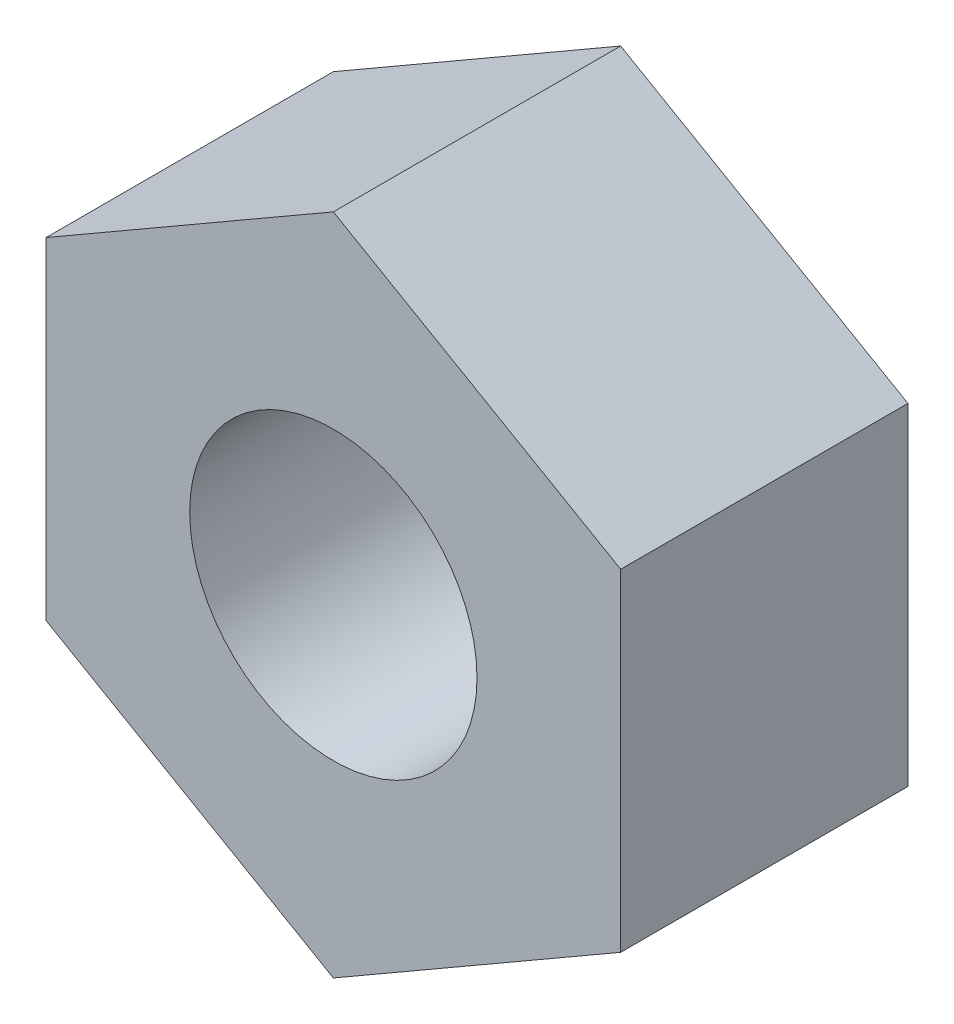
ISO-10303-21;
HEADER;
FILE_DESCRIPTION(('STEP AP214'),'2;1');
FILE_NAME('part.step','',(''),(''),'','','');
FILE_SCHEMA(('AUTOMOTIVE_DESIGN { 1 0 10303 214 1 1 1 1 }'));
ENDSEC;
DATA;
#1=APPLICATION_CONTEXT('core data for automotive mechanical design processes');
#2=APPLICATION_PROTOCOL_DEFINITION('international standard','automotive_design',2000,#1);
#3=PRODUCT_CONTEXT('',#1,'mechanical');
#4=PRODUCT('Part','Part','',(#3));
#5=PRODUCT_RELATED_PRODUCT_CATEGORY('part','',(#4));
#6=PRODUCT_DEFINITION_FORMATION('','',#4);
#7=PRODUCT_DEFINITION_CONTEXT('part definition',#1,'design');
#8=PRODUCT_DEFINITION('design','',#6,#7);
#9=PRODUCT_DEFINITION_SHAPE('','',#8);
#10=(LENGTH_UNIT() NAMED_UNIT(*) SI_UNIT(.MILLI.,.METRE.));
#11=(NAMED_UNIT(*) PLANE_ANGLE_UNIT() SI_UNIT($,.RADIAN.));
#12=(NAMED_UNIT(*) SI_UNIT($,.STERADIAN.) SOLID_ANGLE_UNIT());
#13=UNCERTAINTY_MEASURE_WITH_UNIT(LENGTH_MEASURE(1.E-05),#10,'distance_accuracy_value','');
#14=(GEOMETRIC_REPRESENTATION_CONTEXT(3) GLOBAL_UNCERTAINTY_ASSIGNED_CONTEXT((#13)) GLOBAL_UNIT_ASSIGNED_CONTEXT((#10,
#11,#12)) REPRESENTATION_CONTEXT('',''));
#15=CARTESIAN_POINT('',(0.,0.,0.));
#16=DIRECTION('',(0.,0.,1.));
#17=DIRECTION('',(1.,0.,0.));
#18=AXIS2_PLACEMENT_3D('',#15,#16,#17);
#19=CARTESIAN_POINT('',(0.,0.,3.));
#20=DIRECTION('',(0.,0.,1.));
#21=DIRECTION('',(1.,0.,0.));
#22=AXIS2_PLACEMENT_3D('',#19,#20,#21);
#23=PLANE('',#22);
#24=DIRECTION('',(-0.866025403784439,0.5,0.));
#25=VECTOR('',#24,1.);
#26=CARTESIAN_POINT('',(3.,1.73205080756888,3.));
#27=LINE('',#26,#25);
#28=CARTESIAN_POINT('',(3.,1.73205080756888,3.));
#29=VERTEX_POINT('',#28);
#30=CARTESIAN_POINT('',(0.,3.46410161513776,3.));
#31=VERTEX_POINT('',#30);
#32=EDGE_CURVE('E130',#29,#31,#27,.T.);
#33=ORIENTED_EDGE('',*,*,#32,.T.);
#34=DIRECTION('',(-0.866025403784439,-0.5,0.));
#35=VECTOR('',#34,1.);
#36=CARTESIAN_POINT('',(0.,3.46410161513776,3.));
#37=LINE('',#36,#35);
#38=CARTESIAN_POINT('',(-3.,1.73205080756888,3.));
#39=VERTEX_POINT('',#38);
#40=EDGE_CURVE('E88',#31,#39,#37,.T.);
#41=ORIENTED_EDGE('',*,*,#40,.T.);
#42=DIRECTION('',(0.,-1.,0.));
#43=VECTOR('',#42,1.);
#44=CARTESIAN_POINT('',(-3.,1.73205080756888,3.));
#45=LINE('',#44,#43);
#46=CARTESIAN_POINT('',(-3.,-1.73205080756888,3.));
#47=VERTEX_POINT('',#46);
#48=EDGE_CURVE('E101',#39,#47,#45,.T.);
#49=ORIENTED_EDGE('',*,*,#48,.T.);
#50=DIRECTION('',(0.866025403784438,-0.5,0.));
#51=VECTOR('',#50,1.);
#52=CARTESIAN_POINT('',(-3.,-1.73205080756888,3.));
#53=LINE('',#52,#51);
#54=CARTESIAN_POINT('',(0.,-3.46410161513775,3.));
#55=VERTEX_POINT('',#54);
#56=EDGE_CURVE('E95',#47,#55,#53,.T.);
#57=ORIENTED_EDGE('',*,*,#56,.T.);
#58=DIRECTION('',(0.866025403784439,0.5,0.));
#59=VECTOR('',#58,1.);
#60=CARTESIAN_POINT('',(0.,-3.46410161513775,3.));
#61=LINE('',#60,#59);
#62=CARTESIAN_POINT('',(3.,-1.73205080756888,3.));
#63=VERTEX_POINT('',#62);
#64=EDGE_CURVE('E99',#55,#63,#61,.T.);
#65=ORIENTED_EDGE('',*,*,#64,.T.);
#66=DIRECTION('',(0.,1.,0.));
#67=VECTOR('',#66,1.);
#68=CARTESIAN_POINT('',(3.,-1.73205080756888,3.));
#69=LINE('',#68,#67);
#70=EDGE_CURVE('E51',#63,#29,#69,.T.);
#71=ORIENTED_EDGE('',*,*,#70,.T.);
#72=EDGE_LOOP('',(#33,#41,#49,#57,#65,#71));
#73=FACE_BOUND('',#72,.T.);
#74=CARTESIAN_POINT('',(0.,0.,3.));
#75=DIRECTION('',(0.,0.,1.));
#76=DIRECTION('',(1.,0.,0.));
#77=AXIS2_PLACEMENT_3D('',#74,#75,#76);
#78=CIRCLE('',#77,1.5);
#79=CARTESIAN_POINT('',(1.5,0.,3.));
#80=VERTEX_POINT('',#79);
#81=EDGE_CURVE('E123',#80,#80,#78,.T.);
#82=ORIENTED_EDGE('',*,*,#81,.F.);
#83=EDGE_LOOP('',(#82));
#84=FACE_BOUND('',#83,.T.);
#85=ADVANCED_FACE('F34',(#73,#84),#23,.T.);
#86=CARTESIAN_POINT('',(0.,0.,0.));
#87=DIRECTION('',(0.,0.,1.));
#88=DIRECTION('',(1.,0.,0.));
#89=AXIS2_PLACEMENT_3D('',#86,#87,#88);
#90=PLANE('',#89);
#91=DIRECTION('',(-0.866025403784439,0.5,0.));
#92=VECTOR('',#91,1.);
#93=CARTESIAN_POINT('',(3.,1.73205080756888,0.));
#94=LINE('',#93,#92);
#95=CARTESIAN_POINT('',(3.,1.73205080756888,0.));
#96=VERTEX_POINT('',#95);
#97=CARTESIAN_POINT('',(0.,3.46410161513776,0.));
#98=VERTEX_POINT('',#97);
#99=EDGE_CURVE('E119',#96,#98,#94,.T.);
#100=ORIENTED_EDGE('',*,*,#99,.F.);
#101=DIRECTION('',(0.,1.,0.));
#102=VECTOR('',#101,1.);
#103=CARTESIAN_POINT('',(3.,-1.73205080756888,0.));
#104=LINE('',#103,#102);
#105=CARTESIAN_POINT('',(3.,-1.73205080756888,0.));
#106=VERTEX_POINT('',#105);
#107=EDGE_CURVE('E80',#106,#96,#104,.T.);
#108=ORIENTED_EDGE('',*,*,#107,.F.);
#109=DIRECTION('',(0.866025403784439,0.5,0.));
#110=VECTOR('',#109,1.);
#111=CARTESIAN_POINT('',(0.,-3.46410161513775,0.));
#112=LINE('',#111,#110);
#113=CARTESIAN_POINT('',(0.,-3.46410161513775,0.));
#114=VERTEX_POINT('',#113);
#115=EDGE_CURVE('E74',#114,#106,#112,.T.);
#116=ORIENTED_EDGE('',*,*,#115,.F.);
#117=DIRECTION('',(0.866025403784438,-0.5,0.));
#118=VECTOR('',#117,1.);
#119=CARTESIAN_POINT('',(-3.,-1.73205080756888,0.));
#120=LINE('',#119,#118);
#121=CARTESIAN_POINT('',(-3.,-1.73205080756888,0.));
#122=VERTEX_POINT('',#121);
#123=EDGE_CURVE('E109',#122,#114,#120,.T.);
#124=ORIENTED_EDGE('',*,*,#123,.F.);
#125=DIRECTION('',(0.,-1.,0.));
#126=VECTOR('',#125,1.);
#127=CARTESIAN_POINT('',(-3.,1.73205080756888,0.));
#128=LINE('',#127,#126);
#129=CARTESIAN_POINT('',(-3.,1.73205080756888,0.));
#130=VERTEX_POINT('',#129);
#131=EDGE_CURVE('E125',#130,#122,#128,.T.);
#132=ORIENTED_EDGE('',*,*,#131,.F.);
#133=DIRECTION('',(-0.866025403784439,-0.5,0.));
#134=VECTOR('',#133,1.);
#135=CARTESIAN_POINT('',(0.,3.46410161513776,0.));
#136=LINE('',#135,#134);
#137=EDGE_CURVE('E122',#98,#130,#136,.T.);
#138=ORIENTED_EDGE('',*,*,#137,.F.);
#139=EDGE_LOOP('',(#100,#108,#116,#124,#132,#138));
#140=FACE_BOUND('',#139,.T.);
#141=CARTESIAN_POINT('',(0.,0.,0.));
#142=DIRECTION('',(0.,0.,1.));
#143=DIRECTION('',(1.,0.,0.));
#144=AXIS2_PLACEMENT_3D('',#141,#142,#143);
#145=CIRCLE('',#144,1.5);
#146=CARTESIAN_POINT('',(1.5,0.,0.));
#147=VERTEX_POINT('',#146);
#148=EDGE_CURVE('E223',#147,#147,#145,.T.);
#149=ORIENTED_EDGE('',*,*,#148,.T.);
#150=EDGE_LOOP('',(#149));
#151=FACE_BOUND('',#150,.T.);
#152=ADVANCED_FACE('F139',(#140,#151),#90,.F.);
#153=CARTESIAN_POINT('',(3.,1.73205080756888,3.));
#154=DIRECTION('',(-0.5,-0.866025403784439,0.));
#155=DIRECTION('',(0.866025403784439,-0.5,0.));
#156=AXIS2_PLACEMENT_3D('',#153,#154,#155);
#157=PLANE('',#156);
#158=ORIENTED_EDGE('',*,*,#99,.T.);
#159=DIRECTION('',(0.,0.,-1.));
#160=VECTOR('',#159,1.);
#161=CARTESIAN_POINT('',(0.,3.46410161513776,3.));
#162=LINE('',#161,#160);
#163=EDGE_CURVE('E11',#31,#98,#162,.T.);
#164=ORIENTED_EDGE('',*,*,#163,.F.);
#165=ORIENTED_EDGE('',*,*,#32,.F.);
#166=DIRECTION('',(0.,0.,-1.));
#167=VECTOR('',#166,1.);
#168=CARTESIAN_POINT('',(3.,1.73205080756888,3.));
#169=LINE('',#168,#167);
#170=EDGE_CURVE('E115',#29,#96,#169,.T.);
#171=ORIENTED_EDGE('',*,*,#170,.T.);
#172=EDGE_LOOP('',(#158,#164,#165,#171));
#173=FACE_BOUND('',#172,.T.);
#174=ADVANCED_FACE('F36',(#173),#157,.F.);
#175=CARTESIAN_POINT('',(0.,3.46410161513776,3.));
#176=DIRECTION('',(0.5,-0.866025403784438,0.));
#177=DIRECTION('',(0.866025403784439,0.5,0.));
#178=AXIS2_PLACEMENT_3D('',#175,#176,#177);
#179=PLANE('',#178);
#180=ORIENTED_EDGE('',*,*,#137,.T.);
#181=DIRECTION('',(0.,0.,-1.));
#182=VECTOR('',#181,1.);
#183=CARTESIAN_POINT('',(-3.,1.73205080756888,3.));
#184=LINE('',#183,#182);
#185=EDGE_CURVE('E43',#39,#130,#184,.T.);
#186=ORIENTED_EDGE('',*,*,#185,.F.);
#187=ORIENTED_EDGE('',*,*,#40,.F.);
#188=ORIENTED_EDGE('',*,*,#163,.T.);
#189=EDGE_LOOP('',(#180,#186,#187,#188));
#190=FACE_BOUND('',#189,.T.);
#191=ADVANCED_FACE('F164',(#190),#179,.F.);
#192=CARTESIAN_POINT('',(-3.,1.73205080756888,3.));
#193=DIRECTION('',(1.,0.,0.));
#194=DIRECTION('',(0.,1.,0.));
#195=AXIS2_PLACEMENT_3D('',#192,#193,#194);
#196=PLANE('',#195);
#197=ORIENTED_EDGE('',*,*,#131,.T.);
#198=DIRECTION('',(0.,0.,-1.));
#199=VECTOR('',#198,1.);
#200=CARTESIAN_POINT('',(-3.,-1.73205080756888,3.));
#201=LINE('',#200,#199);
#202=EDGE_CURVE('E110',#47,#122,#201,.T.);
#203=ORIENTED_EDGE('',*,*,#202,.F.);
#204=ORIENTED_EDGE('',*,*,#48,.F.);
#205=ORIENTED_EDGE('',*,*,#185,.T.);
#206=EDGE_LOOP('',(#197,#203,#204,#205));
#207=FACE_BOUND('',#206,.T.);
#208=ADVANCED_FACE('F136',(#207),#196,.F.);
#209=CARTESIAN_POINT('',(-3.,-1.73205080756888,3.));
#210=DIRECTION('',(0.5,0.866025403784439,0.));
#211=DIRECTION('',(-0.866025403784439,0.5,0.));
#212=AXIS2_PLACEMENT_3D('',#209,#210,#211);
#213=PLANE('',#212);
#214=ORIENTED_EDGE('',*,*,#123,.T.);
#215=DIRECTION('',(0.,0.,-1.));
#216=VECTOR('',#215,1.);
#217=CARTESIAN_POINT('',(0.,-3.46410161513775,3.));
#218=LINE('',#217,#216);
#219=EDGE_CURVE('E106',#55,#114,#218,.T.);
#220=ORIENTED_EDGE('',*,*,#219,.F.);
#221=ORIENTED_EDGE('',*,*,#56,.F.);
#222=ORIENTED_EDGE('',*,*,#202,.T.);
#223=EDGE_LOOP('',(#214,#220,#221,#222));
#224=FACE_BOUND('',#223,.T.);
#225=ADVANCED_FACE('F107',(#224),#213,.F.);
#226=CARTESIAN_POINT('',(0.,-3.46410161513775,3.));
#227=DIRECTION('',(-0.5,0.866025403784439,0.));
#228=DIRECTION('',(-0.866025403784439,-0.5,0.));
#229=AXIS2_PLACEMENT_3D('',#226,#227,#228);
#230=PLANE('',#229);
#231=ORIENTED_EDGE('',*,*,#115,.T.);
#232=DIRECTION('',(0.,0.,-1.));
#233=VECTOR('',#232,1.);
#234=CARTESIAN_POINT('',(3.,-1.73205080756888,3.));
#235=LINE('',#234,#233);
#236=EDGE_CURVE('E111',#63,#106,#235,.T.);
#237=ORIENTED_EDGE('',*,*,#236,.F.);
#238=ORIENTED_EDGE('',*,*,#64,.F.);
#239=ORIENTED_EDGE('',*,*,#219,.T.);
#240=EDGE_LOOP('',(#231,#237,#238,#239));
#241=FACE_BOUND('',#240,.T.);
#242=ADVANCED_FACE('F113',(#241),#230,.F.);
#243=CARTESIAN_POINT('',(3.,-1.73205080756888,3.));
#244=DIRECTION('',(-1.,0.,0.));
#245=DIRECTION('',(0.,0.,1.));
#246=AXIS2_PLACEMENT_3D('',#243,#244,#245);
#247=PLANE('',#246);
#248=ORIENTED_EDGE('',*,*,#107,.T.);
#249=ORIENTED_EDGE('',*,*,#170,.F.);
#250=ORIENTED_EDGE('',*,*,#70,.F.);
#251=ORIENTED_EDGE('',*,*,#236,.T.);
#252=EDGE_LOOP('',(#248,#249,#250,#251));
#253=FACE_BOUND('',#252,.T.);
#254=ADVANCED_FACE('F144',(#253),#247,.F.);
#255=CARTESIAN_POINT('',(0.,0.,3.));
#256=DIRECTION('',(0.,0.,-1.));
#257=DIRECTION('',(-1.,0.,0.));
#258=AXIS2_PLACEMENT_3D('',#255,#256,#257);
#259=CYLINDRICAL_SURFACE('',#258,1.5);
#260=ORIENTED_EDGE('',*,*,#81,.T.);
#261=EDGE_LOOP('',(#260));
#262=FACE_BOUND('',#261,.T.);
#263=ORIENTED_EDGE('',*,*,#148,.F.);
#264=EDGE_LOOP('',(#263));
#265=FACE_BOUND('',#264,.T.);
#266=ADVANCED_FACE('F146',(#262,#265),#259,.F.);
#267=CLOSED_SHELL('',(#85,#152,#174,#191,#208,#225,#242,#254,#266));
#268=MANIFOLD_SOLID_BREP('B2',#267);
#269=ADVANCED_BREP_SHAPE_REPRESENTATION('',(#18,#268),#14);
#270=SHAPE_DEFINITION_REPRESENTATION(#9,#269);
ENDSEC;
END-ISO-10303-21;
